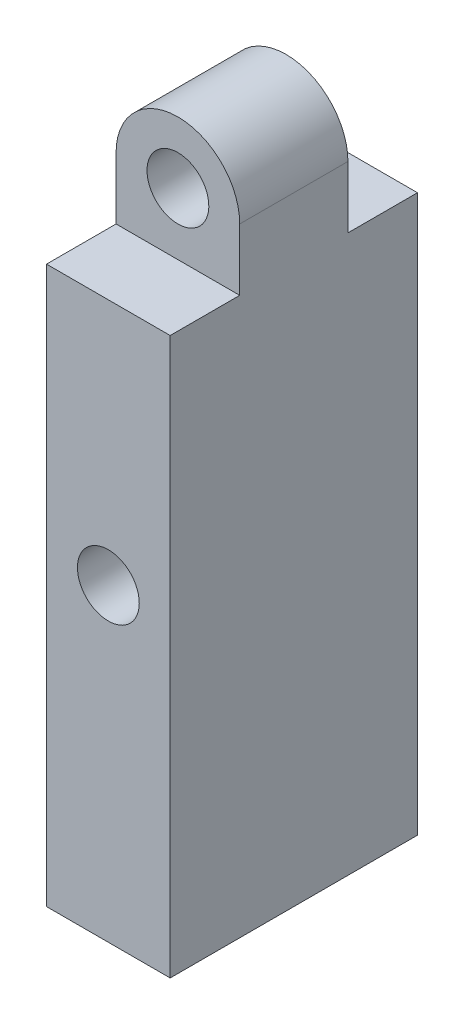
ISO-10303-21;
HEADER;
FILE_DESCRIPTION(('STEP AP214'),'2;1');
FILE_NAME('part.step','',(''),(''),'','','');
FILE_SCHEMA(('AUTOMOTIVE_DESIGN { 1 0 10303 214 1 1 1 1 }'));
ENDSEC;
DATA;
#1=APPLICATION_CONTEXT('core data for automotive mechanical design processes');
#2=APPLICATION_PROTOCOL_DEFINITION('international standard','automotive_design',2000,#1);
#3=PRODUCT_CONTEXT('',#1,'mechanical');
#4=PRODUCT('Part','Part','',(#3));
#5=PRODUCT_RELATED_PRODUCT_CATEGORY('part','',(#4));
#6=PRODUCT_DEFINITION_FORMATION('','',#4);
#7=PRODUCT_DEFINITION_CONTEXT('part definition',#1,'design');
#8=PRODUCT_DEFINITION('design','',#6,#7);
#9=PRODUCT_DEFINITION_SHAPE('','',#8);
#10=(LENGTH_UNIT() NAMED_UNIT(*) SI_UNIT(.MILLI.,.METRE.));
#11=(NAMED_UNIT(*) PLANE_ANGLE_UNIT() SI_UNIT($,.RADIAN.));
#12=(NAMED_UNIT(*) SI_UNIT($,.STERADIAN.) SOLID_ANGLE_UNIT());
#13=UNCERTAINTY_MEASURE_WITH_UNIT(LENGTH_MEASURE(1.E-05),#10,'distance_accuracy_value','');
#14=(GEOMETRIC_REPRESENTATION_CONTEXT(3) GLOBAL_UNCERTAINTY_ASSIGNED_CONTEXT((#13)) GLOBAL_UNIT_ASSIGNED_CONTEXT((#10,
#11,#12)) REPRESENTATION_CONTEXT('',''));
#15=CARTESIAN_POINT('',(0.,0.,0.));
#16=DIRECTION('',(0.,0.,1.));
#17=DIRECTION('',(1.,0.,0.));
#18=AXIS2_PLACEMENT_3D('',#15,#16,#17);
#19=CARTESIAN_POINT('',(-0.244261307550768,5.43627561659298,4.));
#20=DIRECTION('',(0.,0.,1.));
#21=DIRECTION('',(1.,0.,0.));
#22=AXIS2_PLACEMENT_3D('',#19,#20,#21);
#23=PLANE('',#22);
#24=DIRECTION('',(1.,0.,0.));
#25=VECTOR('',#24,1.);
#26=CARTESIAN_POINT('',(-1.24426130755077,4.43627561659298,4.));
#27=LINE('',#26,#25);
#28=CARTESIAN_POINT('',(-1.24426130755077,4.43627561659298,4.));
#29=VERTEX_POINT('',#28);
#30=CARTESIAN_POINT('',(0.755738692449232,4.43627561659298,4.));
#31=VERTEX_POINT('',#30);
#32=EDGE_CURVE('E50',#29,#31,#27,.T.);
#33=ORIENTED_EDGE('',*,*,#32,.F.);
#34=DIRECTION('',(0.,-1.,0.));
#35=VECTOR('',#34,1.);
#36=CARTESIAN_POINT('',(-1.24426130755077,-4.56372438340702,4.));
#37=LINE('',#36,#35);
#38=CARTESIAN_POINT('',(-1.24426130755077,-4.56372438340702,4.));
#39=VERTEX_POINT('',#38);
#40=EDGE_CURVE('E152',#29,#39,#37,.T.);
#41=ORIENTED_EDGE('',*,*,#40,.T.);
#42=DIRECTION('',(1.,0.,0.));
#43=VECTOR('',#42,1.);
#44=CARTESIAN_POINT('',(-1.24426130755077,-4.56372438340702,4.));
#45=LINE('',#44,#43);
#46=CARTESIAN_POINT('',(0.755738692449232,-4.56372438340702,4.));
#47=VERTEX_POINT('',#46);
#48=EDGE_CURVE('E154',#39,#47,#45,.T.);
#49=ORIENTED_EDGE('',*,*,#48,.T.);
#50=DIRECTION('',(0.,1.,0.));
#51=VECTOR('',#50,1.);
#52=CARTESIAN_POINT('',(0.755738692449232,-4.56372438340702,4.));
#53=LINE('',#52,#51);
#54=EDGE_CURVE('E157',#47,#31,#53,.T.);
#55=ORIENTED_EDGE('',*,*,#54,.T.);
#56=EDGE_LOOP('',(#33,#41,#49,#55));
#57=FACE_BOUND('',#56,.T.);
#58=CARTESIAN_POINT('',(-0.244261307550769,0.436275616592984,4.));
#59=DIRECTION('',(0.,0.,1.));
#60=DIRECTION('',(1.,0.,0.));
#61=AXIS2_PLACEMENT_3D('',#58,#59,#60);
#62=CIRCLE('',#61,0.5);
#63=CARTESIAN_POINT('',(0.255738692449231,0.436275616592984,4.));
#64=VERTEX_POINT('',#63);
#65=EDGE_CURVE('E146',#64,#64,#62,.T.);
#66=ORIENTED_EDGE('',*,*,#65,.F.);
#67=EDGE_LOOP('',(#66));
#68=FACE_BOUND('',#67,.T.);
#69=ADVANCED_FACE('F33',(#57,#68),#23,.T.);
#70=CARTESIAN_POINT('',(-0.244261307550768,5.43627561659298,0.));
#71=DIRECTION('',(0.,0.,1.));
#72=DIRECTION('',(1.,0.,0.));
#73=AXIS2_PLACEMENT_3D('',#70,#71,#72);
#74=PLANE('',#73);
#75=DIRECTION('',(0.,-1.,0.));
#76=VECTOR('',#75,1.);
#77=CARTESIAN_POINT('',(-1.24426130755077,-4.56372438340702,0.));
#78=LINE('',#77,#76);
#79=CARTESIAN_POINT('',(-1.24426130755077,4.43627561659299,0.));
#80=VERTEX_POINT('',#79);
#81=CARTESIAN_POINT('',(-1.24426130755077,-4.56372438340702,0.));
#82=VERTEX_POINT('',#81);
#83=EDGE_CURVE('E149',#80,#82,#78,.T.);
#84=ORIENTED_EDGE('',*,*,#83,.F.);
#85=DIRECTION('',(1.,0.,0.));
#86=VECTOR('',#85,1.);
#87=CARTESIAN_POINT('',(-1.24426130755077,4.43627561659299,0.));
#88=LINE('',#87,#86);
#89=CARTESIAN_POINT('',(0.755738692449232,4.43627561659299,0.));
#90=VERTEX_POINT('',#89);
#91=EDGE_CURVE('E137',#80,#90,#88,.T.);
#92=ORIENTED_EDGE('',*,*,#91,.T.);
#93=DIRECTION('',(0.,1.,0.));
#94=VECTOR('',#93,1.);
#95=CARTESIAN_POINT('',(0.755738692449232,-4.56372438340702,0.));
#96=LINE('',#95,#94);
#97=CARTESIAN_POINT('',(0.755738692449232,-4.56372438340702,0.));
#98=VERTEX_POINT('',#97);
#99=EDGE_CURVE('E155',#98,#90,#96,.T.);
#100=ORIENTED_EDGE('',*,*,#99,.F.);
#101=DIRECTION('',(1.,0.,0.));
#102=VECTOR('',#101,1.);
#103=CARTESIAN_POINT('',(-1.24426130755077,-4.56372438340702,0.));
#104=LINE('',#103,#102);
#105=EDGE_CURVE('E160',#82,#98,#104,.T.);
#106=ORIENTED_EDGE('',*,*,#105,.F.);
#107=EDGE_LOOP('',(#84,#92,#100,#106));
#108=FACE_BOUND('',#107,.T.);
#109=CARTESIAN_POINT('',(-0.244261307550769,0.436275616592984,0.));
#110=DIRECTION('',(0.,0.,1.));
#111=DIRECTION('',(1.,0.,0.));
#112=AXIS2_PLACEMENT_3D('',#109,#110,#111);
#113=CIRCLE('',#112,0.5);
#114=CARTESIAN_POINT('',(0.255738692449231,0.436275616592984,0.));
#115=VERTEX_POINT('',#114);
#116=EDGE_CURVE('E145',#115,#115,#113,.T.);
#117=ORIENTED_EDGE('',*,*,#116,.T.);
#118=EDGE_LOOP('',(#117));
#119=FACE_BOUND('',#118,.T.);
#120=ADVANCED_FACE('F186',(#108,#119),#74,.F.);
#121=CARTESIAN_POINT('',(-0.244261307550768,5.43627561659298,4.));
#122=DIRECTION('',(0.,0.,-1.));
#123=DIRECTION('',(-1.,0.,0.));
#124=AXIS2_PLACEMENT_3D('',#121,#122,#123);
#125=CYLINDRICAL_SURFACE('',#124,1.);
#126=CARTESIAN_POINT('',(-0.244261307550768,5.43627561659298,2.875));
#127=DIRECTION('',(0.,0.,-1.));
#128=DIRECTION('',(0.,1.,0.));
#129=AXIS2_PLACEMENT_3D('',#126,#127,#128);
#130=CIRCLE('',#129,1.);
#131=CARTESIAN_POINT('',(-1.24426130755077,5.43627561659299,2.875));
#132=VERTEX_POINT('',#131);
#133=CARTESIAN_POINT('',(0.755738692449232,5.43627561659299,2.875));
#134=VERTEX_POINT('',#133);
#135=EDGE_CURVE('E143',#132,#134,#130,.T.);
#136=ORIENTED_EDGE('',*,*,#135,.T.);
#137=DIRECTION('',(0.,0.,-1.));
#138=VECTOR('',#137,1.);
#139=CARTESIAN_POINT('',(0.755738692449232,5.43627561659298,4.));
#140=LINE('',#139,#138);
#141=CARTESIAN_POINT('',(0.755738692449232,5.43627561659298,1.125));
#142=VERTEX_POINT('',#141);
#143=EDGE_CURVE('E120',#134,#142,#140,.T.);
#144=ORIENTED_EDGE('',*,*,#143,.T.);
#145=CARTESIAN_POINT('',(-0.244261307550768,5.43627561659298,1.125));
#146=DIRECTION('',(0.,0.,1.));
#147=DIRECTION('',(0.,-1.,0.));
#148=AXIS2_PLACEMENT_3D('',#145,#146,#147);
#149=CIRCLE('',#148,1.);
#150=CARTESIAN_POINT('',(-1.24426130755077,5.43627561659298,1.125));
#151=VERTEX_POINT('',#150);
#152=EDGE_CURVE('E58',#142,#151,#149,.T.);
#153=ORIENTED_EDGE('',*,*,#152,.T.);
#154=DIRECTION('',(0.,0.,-1.));
#155=VECTOR('',#154,1.);
#156=CARTESIAN_POINT('',(-1.24426130755077,5.43627561659298,4.));
#157=LINE('',#156,#155);
#158=EDGE_CURVE('E11',#132,#151,#157,.T.);
#159=ORIENTED_EDGE('',*,*,#158,.F.);
#160=EDGE_LOOP('',(#136,#144,#153,#159));
#161=FACE_BOUND('',#160,.T.);
#162=ADVANCED_FACE('F35',(#161),#125,.T.);
#163=CARTESIAN_POINT('',(-1.24426130755077,-4.56372438340702,4.));
#164=DIRECTION('',(1.,0.,0.));
#165=DIRECTION('',(0.,1.,0.));
#166=AXIS2_PLACEMENT_3D('',#163,#164,#165);
#167=PLANE('',#166);
#168=DIRECTION('',(0.,0.,-1.));
#169=VECTOR('',#168,1.);
#170=CARTESIAN_POINT('',(-1.24426130755077,4.43627561659298,4.));
#171=LINE('',#170,#169);
#172=CARTESIAN_POINT('',(-1.24426130755077,4.43627561659298,2.875));
#173=VERTEX_POINT('',#172);
#174=EDGE_CURVE('E121',#29,#173,#171,.T.);
#175=ORIENTED_EDGE('',*,*,#174,.T.);
#176=DIRECTION('',(0.,1.,0.));
#177=VECTOR('',#176,1.);
#178=CARTESIAN_POINT('',(-1.24426130755077,6.43627561659298,2.875));
#179=LINE('',#178,#177);
#180=EDGE_CURVE('E107',#173,#132,#179,.T.);
#181=ORIENTED_EDGE('',*,*,#180,.T.);
#182=ORIENTED_EDGE('',*,*,#158,.T.);
#183=DIRECTION('',(0.,-1.,0.));
#184=VECTOR('',#183,1.);
#185=CARTESIAN_POINT('',(-1.24426130755077,4.43627561659298,1.125));
#186=LINE('',#185,#184);
#187=CARTESIAN_POINT('',(-1.24426130755077,4.43627561659298,1.125));
#188=VERTEX_POINT('',#187);
#189=EDGE_CURVE('E134',#151,#188,#186,.T.);
#190=ORIENTED_EDGE('',*,*,#189,.T.);
#191=DIRECTION('',(0.,0.,-1.));
#192=VECTOR('',#191,1.);
#193=CARTESIAN_POINT('',(-1.24426130755077,4.43627561659298,1.125));
#194=LINE('',#193,#192);
#195=EDGE_CURVE('E131',#188,#80,#194,.T.);
#196=ORIENTED_EDGE('',*,*,#195,.T.);
#197=ORIENTED_EDGE('',*,*,#83,.T.);
#198=DIRECTION('',(0.,0.,-1.));
#199=VECTOR('',#198,1.);
#200=CARTESIAN_POINT('',(-1.24426130755077,-4.56372438340702,4.));
#201=LINE('',#200,#199);
#202=EDGE_CURVE('E42',#39,#82,#201,.T.);
#203=ORIENTED_EDGE('',*,*,#202,.F.);
#204=ORIENTED_EDGE('',*,*,#40,.F.);
#205=EDGE_LOOP('',(#175,#181,#182,#190,#196,#197,#203,#204));
#206=FACE_BOUND('',#205,.T.);
#207=ADVANCED_FACE('F200',(#206),#167,.F.);
#208=CARTESIAN_POINT('',(-1.24426130755077,-4.56372438340702,4.));
#209=DIRECTION('',(0.,1.,0.));
#210=DIRECTION('',(0.,0.,1.));
#211=AXIS2_PLACEMENT_3D('',#208,#209,#210);
#212=PLANE('',#211);
#213=ORIENTED_EDGE('',*,*,#105,.T.);
#214=DIRECTION('',(0.,0.,-1.));
#215=VECTOR('',#214,1.);
#216=CARTESIAN_POINT('',(0.755738692449232,-4.56372438340702,4.));
#217=LINE('',#216,#215);
#218=EDGE_CURVE('E165',#47,#98,#217,.T.);
#219=ORIENTED_EDGE('',*,*,#218,.F.);
#220=ORIENTED_EDGE('',*,*,#48,.F.);
#221=ORIENTED_EDGE('',*,*,#202,.T.);
#222=EDGE_LOOP('',(#213,#219,#220,#221));
#223=FACE_BOUND('',#222,.T.);
#224=ADVANCED_FACE('F198',(#223),#212,.F.);
#225=CARTESIAN_POINT('',(0.755738692449232,-4.56372438340702,4.));
#226=DIRECTION('',(-1.,0.,0.));
#227=DIRECTION('',(0.,0.,1.));
#228=AXIS2_PLACEMENT_3D('',#225,#226,#227);
#229=PLANE('',#228);
#230=ORIENTED_EDGE('',*,*,#143,.F.);
#231=DIRECTION('',(0.,1.,0.));
#232=VECTOR('',#231,1.);
#233=CARTESIAN_POINT('',(0.755738692449232,6.43627561659298,2.875));
#234=LINE('',#233,#232);
#235=CARTESIAN_POINT('',(0.755738692449232,4.43627561659298,2.875));
#236=VERTEX_POINT('',#235);
#237=EDGE_CURVE('E104',#236,#134,#234,.T.);
#238=ORIENTED_EDGE('',*,*,#237,.F.);
#239=DIRECTION('',(0.,0.,-1.));
#240=VECTOR('',#239,1.);
#241=CARTESIAN_POINT('',(0.755738692449232,4.43627561659298,4.));
#242=LINE('',#241,#240);
#243=EDGE_CURVE('E111',#31,#236,#242,.T.);
#244=ORIENTED_EDGE('',*,*,#243,.F.);
#245=ORIENTED_EDGE('',*,*,#54,.F.);
#246=ORIENTED_EDGE('',*,*,#218,.T.);
#247=ORIENTED_EDGE('',*,*,#99,.T.);
#248=DIRECTION('',(0.,0.,-1.));
#249=VECTOR('',#248,1.);
#250=CARTESIAN_POINT('',(0.755738692449232,4.43627561659298,1.125));
#251=LINE('',#250,#249);
#252=CARTESIAN_POINT('',(0.755738692449232,4.43627561659298,1.125));
#253=VERTEX_POINT('',#252);
#254=EDGE_CURVE('E127',#253,#90,#251,.T.);
#255=ORIENTED_EDGE('',*,*,#254,.F.);
#256=DIRECTION('',(0.,-1.,0.));
#257=VECTOR('',#256,1.);
#258=CARTESIAN_POINT('',(0.755738692449232,4.43627561659298,1.125));
#259=LINE('',#258,#257);
#260=EDGE_CURVE('E129',#142,#253,#259,.T.);
#261=ORIENTED_EDGE('',*,*,#260,.F.);
#262=EDGE_LOOP('',(#230,#238,#244,#245,#246,#247,#255,#261));
#263=FACE_BOUND('',#262,.T.);
#264=ADVANCED_FACE('F118',(#263),#229,.F.);
#265=CARTESIAN_POINT('',(-0.244261307550769,0.436275616592984,4.));
#266=DIRECTION('',(0.,0.,-1.));
#267=DIRECTION('',(-1.,0.,0.));
#268=AXIS2_PLACEMENT_3D('',#265,#266,#267);
#269=CYLINDRICAL_SURFACE('',#268,0.5);
#270=ORIENTED_EDGE('',*,*,#65,.T.);
#271=EDGE_LOOP('',(#270));
#272=FACE_BOUND('',#271,.T.);
#273=ORIENTED_EDGE('',*,*,#116,.F.);
#274=EDGE_LOOP('',(#273));
#275=FACE_BOUND('',#274,.T.);
#276=ADVANCED_FACE('F197',(#272,#275),#269,.F.);
#277=CARTESIAN_POINT('',(-1.24426130755077,4.43627561659298,1.125));
#278=DIRECTION('',(0.,0.,1.));
#279=DIRECTION('',(0.,-1.,0.));
#280=AXIS2_PLACEMENT_3D('',#277,#278,#279);
#281=PLANE('',#280);
#282=CARTESIAN_POINT('',(-0.244261307550768,5.43627561659298,1.125));
#283=DIRECTION('',(0.,0.,1.));
#284=DIRECTION('',(0.,-1.,0.));
#285=AXIS2_PLACEMENT_3D('',#282,#283,#284);
#286=CIRCLE('',#285,0.500000000000001);
#287=CARTESIAN_POINT('',(-0.244261307550768,4.93627561659298,1.125));
#288=VERTEX_POINT('',#287);
#289=EDGE_CURVE('E109',#288,#288,#286,.T.);
#290=ORIENTED_EDGE('',*,*,#289,.T.);
#291=EDGE_LOOP('',(#290));
#292=FACE_BOUND('',#291,.T.);
#293=ORIENTED_EDGE('',*,*,#260,.T.);
#294=DIRECTION('',(1.,0.,0.));
#295=VECTOR('',#294,1.);
#296=CARTESIAN_POINT('',(-1.24426130755077,4.43627561659298,1.125));
#297=LINE('',#296,#295);
#298=EDGE_CURVE('E116',#188,#253,#297,.T.);
#299=ORIENTED_EDGE('',*,*,#298,.F.);
#300=ORIENTED_EDGE('',*,*,#189,.F.);
#301=ORIENTED_EDGE('',*,*,#152,.F.);
#302=EDGE_LOOP('',(#293,#299,#300,#301));
#303=FACE_BOUND('',#302,.T.);
#304=ADVANCED_FACE('F172',(#292,#303),#281,.F.);
#305=CARTESIAN_POINT('',(-1.24426130755077,4.43627561659298,1.125));
#306=DIRECTION('',(0.,-1.,0.));
#307=DIRECTION('',(0.,0.,-1.));
#308=AXIS2_PLACEMENT_3D('',#305,#306,#307);
#309=PLANE('',#308);
#310=ORIENTED_EDGE('',*,*,#91,.F.);
#311=ORIENTED_EDGE('',*,*,#195,.F.);
#312=ORIENTED_EDGE('',*,*,#298,.T.);
#313=ORIENTED_EDGE('',*,*,#254,.T.);
#314=EDGE_LOOP('',(#310,#311,#312,#313));
#315=FACE_BOUND('',#314,.T.);
#316=ADVANCED_FACE('F220',(#315),#309,.F.);
#317=CARTESIAN_POINT('',(-1.24426130755077,6.43627561659298,2.875));
#318=DIRECTION('',(0.,0.,-1.));
#319=DIRECTION('',(0.,1.,0.));
#320=AXIS2_PLACEMENT_3D('',#317,#318,#319);
#321=PLANE('',#320);
#322=CARTESIAN_POINT('',(-0.244261307550768,5.43627561659298,2.875));
#323=DIRECTION('',(0.,0.,-1.));
#324=DIRECTION('',(0.,1.,0.));
#325=AXIS2_PLACEMENT_3D('',#322,#323,#324);
#326=CIRCLE('',#325,0.500000000000001);
#327=CARTESIAN_POINT('',(-0.244261307550768,5.93627561659299,2.875));
#328=VERTEX_POINT('',#327);
#329=EDGE_CURVE('E37',#328,#328,#326,.T.);
#330=ORIENTED_EDGE('',*,*,#329,.T.);
#331=EDGE_LOOP('',(#330));
#332=FACE_BOUND('',#331,.T.);
#333=ORIENTED_EDGE('',*,*,#135,.F.);
#334=ORIENTED_EDGE('',*,*,#180,.F.);
#335=DIRECTION('',(1.,0.,0.));
#336=VECTOR('',#335,1.);
#337=CARTESIAN_POINT('',(-1.24426130755077,4.43627561659298,2.875));
#338=LINE('',#337,#336);
#339=EDGE_CURVE('E101',#173,#236,#338,.T.);
#340=ORIENTED_EDGE('',*,*,#339,.T.);
#341=ORIENTED_EDGE('',*,*,#237,.T.);
#342=EDGE_LOOP('',(#333,#334,#340,#341));
#343=FACE_BOUND('',#342,.T.);
#344=ADVANCED_FACE('F102',(#332,#343),#321,.F.);
#345=CARTESIAN_POINT('',(-1.24426130755077,4.43627561659298,4.));
#346=DIRECTION('',(0.,-1.,0.));
#347=DIRECTION('',(0.,0.,-1.));
#348=AXIS2_PLACEMENT_3D('',#345,#346,#347);
#349=PLANE('',#348);
#350=ORIENTED_EDGE('',*,*,#339,.F.);
#351=ORIENTED_EDGE('',*,*,#174,.F.);
#352=ORIENTED_EDGE('',*,*,#32,.T.);
#353=ORIENTED_EDGE('',*,*,#243,.T.);
#354=EDGE_LOOP('',(#350,#351,#352,#353));
#355=FACE_BOUND('',#354,.T.);
#356=ADVANCED_FACE('F112',(#355),#349,.F.);
#357=CARTESIAN_POINT('',(-0.244261307550768,5.43627561659298,4.));
#358=DIRECTION('',(0.,0.,-1.));
#359=DIRECTION('',(-1.,0.,0.));
#360=AXIS2_PLACEMENT_3D('',#357,#358,#359);
#361=CYLINDRICAL_SURFACE('',#360,0.500000000000001);
#362=ORIENTED_EDGE('',*,*,#329,.F.);
#363=EDGE_LOOP('',(#362));
#364=FACE_BOUND('',#363,.T.);
#365=ORIENTED_EDGE('',*,*,#289,.F.);
#366=EDGE_LOOP('',(#365));
#367=FACE_BOUND('',#366,.T.);
#368=ADVANCED_FACE('F174',(#364,#367),#361,.F.);
#369=CLOSED_SHELL('',(#69,#120,#162,#207,#224,#264,#276,#304,#316,#344,#356,#368));
#370=MANIFOLD_SOLID_BREP('B2',#369);
#371=ADVANCED_BREP_SHAPE_REPRESENTATION('',(#18,#370),#14);
#372=SHAPE_DEFINITION_REPRESENTATION(#9,#371);
ENDSEC;
END-ISO-10303-21;
